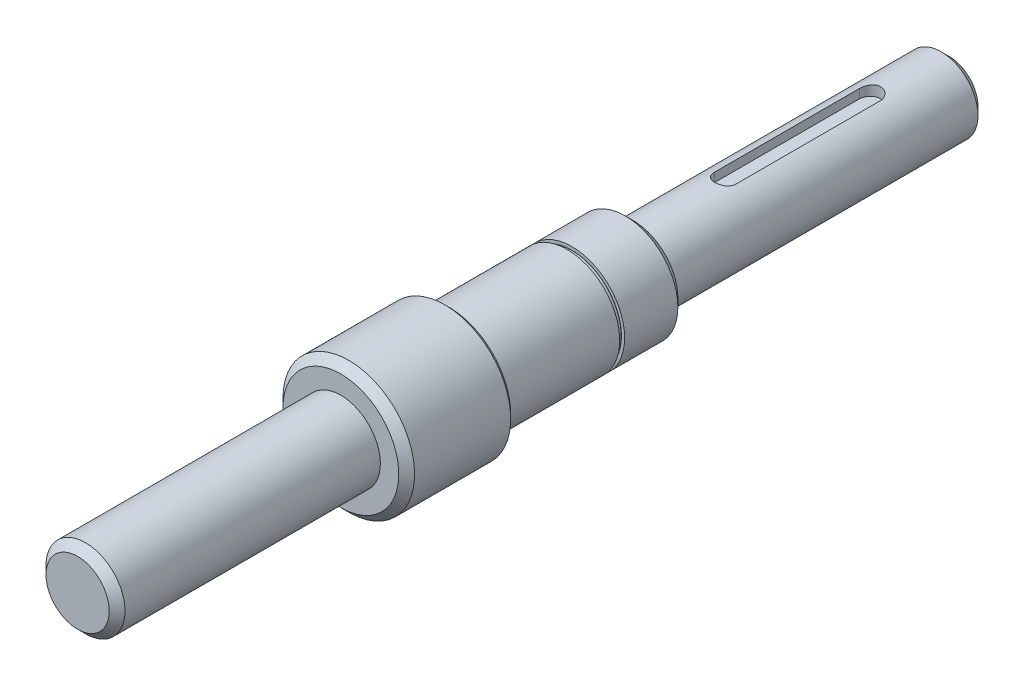
ISO-10303-21;
HEADER;
FILE_DESCRIPTION(('STEP AP214'),'2;1');
FILE_NAME('part.step','',(''),(''),'','','');
FILE_SCHEMA(('AUTOMOTIVE_DESIGN { 1 0 10303 214 1 1 1 1 }'));
ENDSEC;
DATA;
#1=APPLICATION_CONTEXT('core data for automotive mechanical design processes');
#2=APPLICATION_PROTOCOL_DEFINITION('international standard','automotive_design',2000,#1);
#3=PRODUCT_CONTEXT('',#1,'mechanical');
#4=PRODUCT('Part','Part','',(#3));
#5=PRODUCT_RELATED_PRODUCT_CATEGORY('part','',(#4));
#6=PRODUCT_DEFINITION_FORMATION('','',#4);
#7=PRODUCT_DEFINITION_CONTEXT('part definition',#1,'design');
#8=PRODUCT_DEFINITION('design','',#6,#7);
#9=PRODUCT_DEFINITION_SHAPE('','',#8);
#10=(LENGTH_UNIT() NAMED_UNIT(*) SI_UNIT(.MILLI.,.METRE.));
#11=(NAMED_UNIT(*) PLANE_ANGLE_UNIT() SI_UNIT($,.RADIAN.));
#12=(NAMED_UNIT(*) SI_UNIT($,.STERADIAN.) SOLID_ANGLE_UNIT());
#13=UNCERTAINTY_MEASURE_WITH_UNIT(LENGTH_MEASURE(1.E-05),#10,'distance_accuracy_value','');
#14=(GEOMETRIC_REPRESENTATION_CONTEXT(3) GLOBAL_UNCERTAINTY_ASSIGNED_CONTEXT((#13)) GLOBAL_UNIT_ASSIGNED_CONTEXT((#10,
#11,#12)) REPRESENTATION_CONTEXT('',''));
#15=CARTESIAN_POINT('',(0.,0.,0.));
#16=DIRECTION('',(0.,0.,1.));
#17=DIRECTION('',(1.,0.,0.));
#18=AXIS2_PLACEMENT_3D('',#15,#16,#17);
#19=CARTESIAN_POINT('',(0.,0.,0.));
#20=DIRECTION('',(0.,0.,1.));
#21=DIRECTION('',(1.,0.,0.));
#22=AXIS2_PLACEMENT_3D('',#19,#20,#21);
#23=CYLINDRICAL_SURFACE('',#22,20.);
#24=CARTESIAN_POINT('',(0.,0.,-185.925));
#25=DIRECTION('',(0.,0.,-1.));
#26=DIRECTION('',(-1.,0.,0.));
#27=AXIS2_PLACEMENT_3D('',#24,#25,#26);
#28=CIRCLE('',#27,20.);
#29=CARTESIAN_POINT('',(-20.,0.,-185.925));
#30=VERTEX_POINT('',#29);
#31=EDGE_CURVE('E124',#30,#30,#28,.T.);
#32=ORIENTED_EDGE('',*,*,#31,.F.);
#33=EDGE_LOOP('',(#32));
#34=FACE_BOUND('',#33,.T.);
#35=CARTESIAN_POINT('',(0.,0.,-141.));
#36=DIRECTION('',(0.,0.,-1.));
#37=DIRECTION('',(-1.,0.,0.));
#38=AXIS2_PLACEMENT_3D('',#35,#36,#37);
#39=CIRCLE('',#38,20.);
#40=CARTESIAN_POINT('',(-20.,0.,-141.));
#41=VERTEX_POINT('',#40);
#42=EDGE_CURVE('E111',#41,#41,#39,.T.);
#43=ORIENTED_EDGE('',*,*,#42,.T.);
#44=EDGE_LOOP('',(#43));
#45=FACE_BOUND('',#44,.T.);
#46=ADVANCED_FACE('F47',(#34,#45),#23,.T.);
#47=CARTESIAN_POINT('',(0.,0.,-185.925));
#48=DIRECTION('',(0.,0.,-1.));
#49=DIRECTION('',(-1.,0.,0.));
#50=AXIS2_PLACEMENT_3D('',#47,#48,#49);
#51=PLANE('',#50);
#52=CARTESIAN_POINT('',(0.,0.,-185.925));
#53=DIRECTION('',(0.,0.,-1.));
#54=DIRECTION('',(-1.,0.,0.));
#55=AXIS2_PLACEMENT_3D('',#52,#53,#54);
#56=CIRCLE('',#55,18.8);
#57=CARTESIAN_POINT('',(-18.8,0.,-185.925));
#58=VERTEX_POINT('',#57);
#59=EDGE_CURVE('E168',#58,#58,#56,.F.);
#60=ORIENTED_EDGE('',*,*,#59,.T.);
#61=EDGE_LOOP('',(#60));
#62=FACE_BOUND('',#61,.T.);
#63=ORIENTED_EDGE('',*,*,#31,.T.);
#64=EDGE_LOOP('',(#63));
#65=FACE_BOUND('',#64,.T.);
#66=ADVANCED_FACE('F235',(#62,#65),#51,.T.);
#67=CARTESIAN_POINT('',(0.,0.,-187.775));
#68=DIRECTION('',(0.,0.,-1.));
#69=DIRECTION('',(-1.,0.,0.));
#70=AXIS2_PLACEMENT_3D('',#67,#68,#69);
#71=PLANE('',#70);
#72=CARTESIAN_POINT('',(0.,0.,-187.775));
#73=DIRECTION('',(0.,0.,-1.));
#74=DIRECTION('',(-1.,0.,0.));
#75=AXIS2_PLACEMENT_3D('',#72,#73,#74);
#76=CIRCLE('',#75,18.8);
#77=CARTESIAN_POINT('',(-18.8,0.,-187.775));
#78=VERTEX_POINT('',#77);
#79=EDGE_CURVE('E169',#78,#78,#76,.T.);
#80=ORIENTED_EDGE('',*,*,#79,.T.);
#81=EDGE_LOOP('',(#80));
#82=FACE_BOUND('',#81,.T.);
#83=CARTESIAN_POINT('',(0.,0.,-187.775));
#84=DIRECTION('',(0.,0.,-1.));
#85=DIRECTION('',(-1.,0.,0.));
#86=AXIS2_PLACEMENT_3D('',#83,#84,#85);
#87=CIRCLE('',#86,20.);
#88=CARTESIAN_POINT('',(-20.,0.,-187.775));
#89=VERTEX_POINT('',#88);
#90=EDGE_CURVE('E121',#89,#89,#87,.T.);
#91=ORIENTED_EDGE('',*,*,#90,.F.);
#92=EDGE_LOOP('',(#91));
#93=FACE_BOUND('',#92,.T.);
#94=ADVANCED_FACE('F238',(#82,#93),#71,.F.);
#95=CARTESIAN_POINT('',(0.,0.,-185.925));
#96=DIRECTION('',(0.,0.,-1.));
#97=DIRECTION('',(-1.,0.,0.));
#98=AXIS2_PLACEMENT_3D('',#95,#96,#97);
#99=CYLINDRICAL_SURFACE('',#98,18.75);
#100=CARTESIAN_POINT('',(0.,0.,-185.975));
#101=DIRECTION('',(0.,0.,-1.));
#102=DIRECTION('',(-1.,0.,0.));
#103=AXIS2_PLACEMENT_3D('',#100,#101,#102);
#104=CIRCLE('',#103,18.75);
#105=CARTESIAN_POINT('',(-18.75,0.,-185.975));
#106=VERTEX_POINT('',#105);
#107=EDGE_CURVE('E164',#106,#106,#104,.T.);
#108=ORIENTED_EDGE('',*,*,#107,.T.);
#109=EDGE_LOOP('',(#108));
#110=FACE_BOUND('',#109,.T.);
#111=CARTESIAN_POINT('',(0.,0.,-187.725));
#112=DIRECTION('',(0.,0.,-1.));
#113=DIRECTION('',(-1.,0.,0.));
#114=AXIS2_PLACEMENT_3D('',#111,#112,#113);
#115=CIRCLE('',#114,18.75);
#116=CARTESIAN_POINT('',(-18.75,0.,-187.725));
#117=VERTEX_POINT('',#116);
#118=EDGE_CURVE('E158',#117,#117,#115,.F.);
#119=ORIENTED_EDGE('',*,*,#118,.T.);
#120=EDGE_LOOP('',(#119));
#121=FACE_BOUND('',#120,.T.);
#122=ADVANCED_FACE('F205',(#110,#121),#99,.T.);
#123=CARTESIAN_POINT('',(0.,0.,-301.));
#124=DIRECTION('',(0.,0.,-1.));
#125=DIRECTION('',(-1.,0.,0.));
#126=AXIS2_PLACEMENT_3D('',#123,#124,#125);
#127=CONICAL_SURFACE('',#126,5.09999999999999,1.02974425867665);
#128=CARTESIAN_POINT('',(0.,0.,-297.935610842959));
#129=VERTEX_POINT('',#128);
#130=VERTEX_LOOP('',#129);
#131=FACE_BOUND('',#130,.T.);
#132=CARTESIAN_POINT('',(0.,0.,-301.));
#133=DIRECTION('',(0.,0.,-1.));
#134=DIRECTION('',(-1.,0.,0.));
#135=AXIS2_PLACEMENT_3D('',#132,#133,#134);
#136=CIRCLE('',#135,5.09999999999999);
#137=CARTESIAN_POINT('',(-5.09999999999999,0.,-301.));
#138=VERTEX_POINT('',#137);
#139=EDGE_CURVE('E134',#138,#138,#136,.T.);
#140=ORIENTED_EDGE('',*,*,#139,.T.);
#141=EDGE_LOOP('',(#140));
#142=FACE_BOUND('',#141,.T.);
#143=ADVANCED_FACE('F387',(#131,#142),#127,.F.);
#144=CARTESIAN_POINT('',(0.,0.,-331.));
#145=DIRECTION('',(0.,0.,-1.));
#146=DIRECTION('',(-1.,0.,0.));
#147=AXIS2_PLACEMENT_3D('',#144,#145,#146);
#148=CYLINDRICAL_SURFACE('',#147,5.09999999999999);
#149=ORIENTED_EDGE('',*,*,#139,.F.);
#150=EDGE_LOOP('',(#149));
#151=FACE_BOUND('',#150,.T.);
#152=CARTESIAN_POINT('',(0.,0.,-331.));
#153=DIRECTION('',(0.,0.,-1.));
#154=DIRECTION('',(-1.,0.,0.));
#155=AXIS2_PLACEMENT_3D('',#152,#153,#154);
#156=CIRCLE('',#155,5.1);
#157=CARTESIAN_POINT('',(-5.1,0.,-331.));
#158=VERTEX_POINT('',#157);
#159=EDGE_CURVE('E127',#158,#158,#156,.T.);
#160=ORIENTED_EDGE('',*,*,#159,.T.);
#161=EDGE_LOOP('',(#160));
#162=FACE_BOUND('',#161,.T.);
#163=ADVANCED_FACE('F386',(#151,#162),#148,.F.);
#164=CARTESIAN_POINT('',(0.,14.,-331.));
#165=DIRECTION('',(0.,0.,1.));
#166=DIRECTION('',(1.,0.,0.));
#167=AXIS2_PLACEMENT_3D('',#164,#165,#166);
#168=PLANE('',#167);
#169=ORIENTED_EDGE('',*,*,#159,.F.);
#170=EDGE_LOOP('',(#169));
#171=FACE_BOUND('',#170,.T.);
#172=CARTESIAN_POINT('',(0.,0.,-331.));
#173=DIRECTION('',(0.,0.,1.));
#174=DIRECTION('',(1.,0.,0.));
#175=AXIS2_PLACEMENT_3D('',#172,#173,#174);
#176=CIRCLE('',#175,11.0000000000001);
#177=CARTESIAN_POINT('',(11.0000000000001,0.,-331.));
#178=VERTEX_POINT('',#177);
#179=EDGE_CURVE('E160',#178,#178,#176,.F.);
#180=ORIENTED_EDGE('',*,*,#179,.T.);
#181=EDGE_LOOP('',(#180));
#182=FACE_BOUND('',#181,.T.);
#183=ADVANCED_FACE('F266',(#171,#182),#168,.F.);
#184=CARTESIAN_POINT('',(0.,0.,-328.));
#185=DIRECTION('',(0.,0.,1.));
#186=DIRECTION('',(1.,0.,0.));
#187=AXIS2_PLACEMENT_3D('',#184,#185,#186);
#188=CONICAL_SURFACE('',#187,14.,0.785398163397451);
#189=ORIENTED_EDGE('',*,*,#179,.F.);
#190=EDGE_LOOP('',(#189));
#191=FACE_BOUND('',#190,.T.);
#192=CARTESIAN_POINT('',(0.,0.,-328.));
#193=DIRECTION('',(0.,0.,1.));
#194=DIRECTION('',(1.,0.,0.));
#195=AXIS2_PLACEMENT_3D('',#192,#193,#194);
#196=CIRCLE('',#195,14.);
#197=CARTESIAN_POINT('',(14.,0.,-328.));
#198=VERTEX_POINT('',#197);
#199=EDGE_CURVE('E152',#198,#198,#196,.T.);
#200=ORIENTED_EDGE('',*,*,#199,.F.);
#201=EDGE_LOOP('',(#200));
#202=FACE_BOUND('',#201,.T.);
#203=ADVANCED_FACE('F257',(#191,#202),#188,.T.);
#204=CARTESIAN_POINT('',(0.,0.,0.));
#205=DIRECTION('',(0.,0.,1.));
#206=DIRECTION('',(1.,0.,0.));
#207=AXIS2_PLACEMENT_3D('',#204,#205,#206);
#208=CYLINDRICAL_SURFACE('',#207,14.);
#209=DIRECTION('',(0.,0.,1.));
#210=VECTOR('',#209,1.);
#211=CARTESIAN_POINT('',(-4.00000000000005,13.4164078649987,0.));
#212=LINE('',#211,#210);
#213=CARTESIAN_POINT('',(-4.00000000000001,13.4164078649987,-246.));
#214=VERTEX_POINT('',#213);
#215=CARTESIAN_POINT('',(-4.,13.4164078649987,-301.));
#216=VERTEX_POINT('',#215);
#217=EDGE_CURVE('E182',#214,#216,#212,.F.);
#218=ORIENTED_EDGE('',*,*,#217,.T.);
#219=CARTESIAN_POINT('',(-4.,13.4164078649987,-301.));
#220=CARTESIAN_POINT('',(-4.00001343424813,13.4163934343768,-301.110036938265));
#221=CARTESIAN_POINT('',(-3.99545969266926,13.417761265702,-301.220065459872));
#222=CARTESIAN_POINT('',(-3.97732232121695,13.4231542734801,-301.439287989373));
#223=CARTESIAN_POINT('',(-3.96374056379899,13.4271788988993,-301.548482165565));
#224=CARTESIAN_POINT('',(-3.92769415038321,13.4377658850065,-301.765008682583));
#225=CARTESIAN_POINT('',(-3.90525054417986,13.4443222312206,-301.872344810754));
#226=CARTESIAN_POINT('',(-3.85169716989989,13.4597622573638,-302.084633002554));
#227=CARTESIAN_POINT('',(-3.82058720849962,13.4686459892105,-302.189585012944));
#228=CARTESIAN_POINT('',(-3.71462722105447,13.4984072106126,-302.499717642999));
#229=CARTESIAN_POINT('',(-3.6271037719038,13.5224082651875,-302.700432400308));
#230=CARTESIAN_POINT('',(-3.42099335445292,13.5760110031023,-303.084316862067));
#231=CARTESIAN_POINT('',(-3.30239378136284,13.6056149576787,-303.267479405898));
#232=CARTESIAN_POINT('',(-3.03385514387189,13.6680345915526,-303.616369404888));
#233=CARTESIAN_POINT('',(-2.88318637668458,13.7009134336833,-303.78152502006));
#234=CARTESIAN_POINT('',(-2.55635049218509,13.7656378360174,-304.08460135598));
#235=CARTESIAN_POINT('',(-2.38017915468808,13.7974832241344,-304.222517560181));
#236=CARTESIAN_POINT('',(-2.00328797864422,13.8572672913436,-304.46965938831));
#237=CARTESIAN_POINT('',(-1.80217262010784,13.885122326296,-304.57830390558));
#238=CARTESIAN_POINT('',(-1.38360719231062,13.9330517158678,-304.760007003573));
#239=CARTESIAN_POINT('',(-1.1661610438381,13.9531279309862,-304.833074094601));
#240=CARTESIAN_POINT('',(-0.727119470413165,13.9827902284191,-304.939668316764));
#241=CARTESIAN_POINT('',(-0.505780313916704,13.9926363331616,-304.974177311461));
#242=CARTESIAN_POINT('',(-0.0602449633135534,14.0016419286283,-305.005773527505));
#243=CARTESIAN_POINT('',(0.163950738694262,14.0008032358133,-305.002867109631));
#244=CARTESIAN_POINT('',(0.601961495843499,13.9887201082301,-304.960387183875));
#245=CARTESIAN_POINT('',(0.815889248066107,13.9777773149303,-304.921876540054));
#246=CARTESIAN_POINT('',(1.23410663687488,13.9470775079522,-304.811008876966));
#247=CARTESIAN_POINT('',(1.43839578630405,13.9273200492871,-304.738650148951));
#248=CARTESIAN_POINT('',(1.8341490169319,13.8807804985664,-304.561381109693));
#249=CARTESIAN_POINT('',(2.02544821255194,13.8539238723959,-304.456123112832));
#250=CARTESIAN_POINT('',(2.38801825135017,13.7960546774321,-304.216306263055));
#251=CARTESIAN_POINT('',(2.55928501856377,13.7650412656095,-304.081741463019));
#252=CARTESIAN_POINT('',(2.88324485398745,13.7009177251593,-303.781613203087));
#253=CARTESIAN_POINT('',(3.03507809124178,13.6677722027509,-303.615129667492));
#254=CARTESIAN_POINT('',(3.30897556854654,13.6040627781022,-303.258573557128));
#255=CARTESIAN_POINT('',(3.43103136574908,13.573499609643,-303.068494315225));
#256=CARTESIAN_POINT('',(3.58945338157004,13.5321405016799,-302.768841328102));
#257=CARTESIAN_POINT('',(3.63832313759783,13.5190503394637,-302.666010156567));
#258=CARTESIAN_POINT('',(3.72718558970198,13.4948216745023,-302.456373741282));
#259=CARTESIAN_POINT('',(3.76718189032699,13.4836823796704,-302.349570131867));
#260=CARTESIAN_POINT('',(3.83791732102716,13.463719461374,-302.132861334789));
#261=CARTESIAN_POINT('',(3.86866612224973,13.4548934199316,-302.022959519801));
#262=CARTESIAN_POINT('',(3.92067829243348,13.4398293634308,-301.800804060039));
#263=CARTESIAN_POINT('',(3.9419460559715,13.4335901494402,-301.688551530165));
#264=CARTESIAN_POINT('',(3.97223001063663,13.4246640965205,-301.480267797862));
#265=CARTESIAN_POINT('',(3.98264484818433,13.4215735027143,-301.384454640876));
#266=CARTESIAN_POINT('',(3.99652828145244,13.4174428037393,-301.192430219405));
#267=CARTESIAN_POINT('',(4.00000747148811,13.4163995712304,-301.096219787408));
#268=CARTESIAN_POINT('',(4.,13.4164078649987,-301.));
#269=B_SPLINE_CURVE_WITH_KNOTS('',3,(#219,#220,#221,#222,#223,#224,#225,#226,#227,#228,#229,
#230,#231,#232,#233,#234,#235,#236,#237,#238,#239,#240,#241,#242,#243,#244,#245,#246,#247,#248,
#249,#250,#251,#252,#253,#254,#255,#256,#257,#258,#259,#260,#261,#262,#263,#264,#265,#266,#267,
#268),.UNSPECIFIED.,.F.,.F.,(4,2,2,2,2,2,2,2,2,2,2,2,2,2,2,2,2,2,2,2,2,2,2,2,4),(0.,
0.32999374304361,0.659919065086379,0.98906537585001,1.31821902959231,1.97575167696559,
2.6335514401874,3.30832474645295,3.98320984263715,4.67064278038706,5.35791119973412,
6.02724874934375,6.69647251025091,7.34634193868017,7.99624417788576,8.65326120487291,
9.31041168231768,9.99056134493204,10.6709036279931,11.0143588121195,11.357674222404,
11.700629330619,12.0434253092463,12.3324405185762,12.6210139131113),.UNSPECIFIED.);
#270=CARTESIAN_POINT('',(4.,13.4164078649987,-301.));
#271=VERTEX_POINT('',#270);
#272=EDGE_CURVE('E203',#216,#271,#269,.T.);
#273=ORIENTED_EDGE('',*,*,#272,.T.);
#274=DIRECTION('',(0.,0.,1.));
#275=VECTOR('',#274,1.);
#276=CARTESIAN_POINT('',(3.99999999999997,13.4164078649987,0.));
#277=LINE('',#276,#275);
#278=CARTESIAN_POINT('',(3.99999999999997,13.4164078649987,-246.));
#279=VERTEX_POINT('',#278);
#280=EDGE_CURVE('E94',#271,#279,#277,.T.);
#281=ORIENTED_EDGE('',*,*,#280,.T.);
#282=CARTESIAN_POINT('',(3.99999999999999,13.4164078649987,-246.));
#283=CARTESIAN_POINT('',(4.00001343424813,13.4163934343768,-245.889963061735));
#284=CARTESIAN_POINT('',(3.99545969266926,13.417761265702,-245.779934540128));
#285=CARTESIAN_POINT('',(3.97732232121694,13.4231542734801,-245.560712010627));
#286=CARTESIAN_POINT('',(3.96374056379898,13.4271788988993,-245.451517834435));
#287=CARTESIAN_POINT('',(3.9276941503832,13.4377658850065,-245.234991317418));
#288=CARTESIAN_POINT('',(3.90525054417985,13.4443222312206,-245.127655189246));
#289=CARTESIAN_POINT('',(3.85169716989988,13.4597622573638,-244.915366997446));
#290=CARTESIAN_POINT('',(3.82058720849961,13.4686459892105,-244.810414987056));
#291=CARTESIAN_POINT('',(3.71462722105447,13.4984072106126,-244.500282357001));
#292=CARTESIAN_POINT('',(3.62710377190382,13.5224082651875,-244.299567599693));
#293=CARTESIAN_POINT('',(3.42099335445293,13.5760110031023,-243.915683137933));
#294=CARTESIAN_POINT('',(3.30239378136283,13.6056149576788,-243.732520594102));
#295=CARTESIAN_POINT('',(3.03385514387187,13.6680345915527,-243.383630595112));
#296=CARTESIAN_POINT('',(2.88318637668458,13.7009134336833,-243.21847497994));
#297=CARTESIAN_POINT('',(2.55635049218508,13.7656378360174,-242.91539864402));
#298=CARTESIAN_POINT('',(2.38017915468807,13.7974832241344,-242.777482439819));
#299=CARTESIAN_POINT('',(2.00328797864421,13.8572672913436,-242.53034061169));
#300=CARTESIAN_POINT('',(1.80217262010786,13.885122326296,-242.42169609442));
#301=CARTESIAN_POINT('',(1.38360719231065,13.9330517158678,-242.239992996427));
#302=CARTESIAN_POINT('',(1.16616104383813,13.9531279309862,-242.166925905399));
#303=CARTESIAN_POINT('',(0.727119470413182,13.9827902284191,-242.060331683236));
#304=CARTESIAN_POINT('',(0.505780313916717,13.9926363331616,-242.025822688539));
#305=CARTESIAN_POINT('',(0.0602449633135534,14.0016419286283,-241.994226472495));
#306=CARTESIAN_POINT('',(-0.163950738694273,14.0008032358133,-241.997132890369));
#307=CARTESIAN_POINT('',(-0.601961495843524,13.9887201082301,-242.039612816125));
#308=CARTESIAN_POINT('',(-0.815889248066136,13.9777773149303,-242.078123459946));
#309=CARTESIAN_POINT('',(-1.2341066368749,13.9470775079522,-242.188991123034));
#310=CARTESIAN_POINT('',(-1.43839578630406,13.9273200492871,-242.261349851049));
#311=CARTESIAN_POINT('',(-1.8341490169319,13.8807804985664,-242.438618890307));
#312=CARTESIAN_POINT('',(-2.02544821255194,13.8539238723959,-242.543876887169));
#313=CARTESIAN_POINT('',(-2.38801825135016,13.7960546774321,-242.783693736945));
#314=CARTESIAN_POINT('',(-2.55928501856377,13.7650412656095,-242.918258536981));
#315=CARTESIAN_POINT('',(-2.88324485398744,13.7009177251593,-243.218386796913));
#316=CARTESIAN_POINT('',(-3.03507809124177,13.6677722027509,-243.384870332508));
#317=CARTESIAN_POINT('',(-3.30897556854653,13.6040627781022,-243.741426442872));
#318=CARTESIAN_POINT('',(-3.43103136574906,13.573499609643,-243.931505684775));
#319=CARTESIAN_POINT('',(-3.58945338157004,13.5321405016799,-244.231158671898));
#320=CARTESIAN_POINT('',(-3.63832313759783,13.5190503394637,-244.333989843433));
#321=CARTESIAN_POINT('',(-3.72718558970199,13.4948216745023,-244.543626258718));
#322=CARTESIAN_POINT('',(-3.767181890327,13.4836823796704,-244.650429868133));
#323=CARTESIAN_POINT('',(-3.83791732102718,13.463719461374,-244.867138665211));
#324=CARTESIAN_POINT('',(-3.86866612224974,13.4548934199316,-244.977040480199));
#325=CARTESIAN_POINT('',(-3.92067829243349,13.4398293634308,-245.199195939961));
#326=CARTESIAN_POINT('',(-3.94194605597151,13.4335901494402,-245.311448469835));
#327=CARTESIAN_POINT('',(-3.97223001063664,13.4246640965205,-245.519732202138));
#328=CARTESIAN_POINT('',(-3.98264484818435,13.4215735027143,-245.615545359124));
#329=CARTESIAN_POINT('',(-3.99652828145244,13.4174428037393,-245.807569780596));
#330=CARTESIAN_POINT('',(-4.00000747148811,13.4163995712304,-245.903780212592));
#331=CARTESIAN_POINT('',(-4.00000000000001,13.4164078649987,-246.));
#332=B_SPLINE_CURVE_WITH_KNOTS('',3,(#282,#283,#284,#285,#286,#287,#288,#289,#290,#291,#292,
#293,#294,#295,#296,#297,#298,#299,#300,#301,#302,#303,#304,#305,#306,#307,#308,#309,#310,#311,
#312,#313,#314,#315,#316,#317,#318,#319,#320,#321,#322,#323,#324,#325,#326,#327,#328,#329,#330,
#331),.UNSPECIFIED.,.F.,.F.,(4,2,2,2,2,2,2,2,2,2,2,2,2,2,2,2,2,2,2,2,2,2,2,2,4),(0.,
0.329993743043637,0.65991906508638,0.989065375850039,1.31821902959231,1.97575167696556,
2.63355144018741,3.30832474645297,3.98320984263714,4.67064278038705,5.35791119973408,
6.02724874934374,6.69647251025093,7.3463419386802,7.99624417788576,8.65326120487288,
9.31041168231765,9.99056134493198,10.6709036279931,11.0143588121194,11.357674222404,
11.700629330619,12.0434253092463,12.3324405185763,12.6210139131113),.UNSPECIFIED.);
#333=EDGE_CURVE('E171',#279,#214,#332,.T.);
#334=ORIENTED_EDGE('',*,*,#333,.T.);
#335=EDGE_LOOP('',(#218,#273,#281,#334));
#336=FACE_BOUND('',#335,.T.);
#337=ORIENTED_EDGE('',*,*,#199,.T.);
#338=EDGE_LOOP('',(#337));
#339=FACE_BOUND('',#338,.T.);
#340=CARTESIAN_POINT('',(0.,0.,-211.));
#341=DIRECTION('',(0.,0.,1.));
#342=DIRECTION('',(1.,0.,0.));
#343=AXIS2_PLACEMENT_3D('',#340,#341,#342);
#344=CIRCLE('',#343,14.);
#345=CARTESIAN_POINT('',(14.,0.,-211.));
#346=VERTEX_POINT('',#345);
#347=EDGE_CURVE('E137',#346,#346,#344,.T.);
#348=ORIENTED_EDGE('',*,*,#347,.F.);
#349=EDGE_LOOP('',(#348));
#350=FACE_BOUND('',#349,.T.);
#351=ADVANCED_FACE('F185',(#336,#339,#350),#208,.T.);
#352=CARTESIAN_POINT('',(0.,20.,-211.));
#353=DIRECTION('',(0.,0.,1.));
#354=DIRECTION('',(1.,0.,0.));
#355=AXIS2_PLACEMENT_3D('',#352,#353,#354);
#356=PLANE('',#355);
#357=CARTESIAN_POINT('',(0.,0.,-211.));
#358=DIRECTION('',(0.,0.,1.));
#359=DIRECTION('',(1.,0.,0.));
#360=AXIS2_PLACEMENT_3D('',#357,#358,#359);
#361=CIRCLE('',#360,17.0000000000001);
#362=CARTESIAN_POINT('',(17.0000000000001,0.,-211.));
#363=VERTEX_POINT('',#362);
#364=EDGE_CURVE('E11',#363,#363,#361,.F.);
#365=ORIENTED_EDGE('',*,*,#364,.T.);
#366=EDGE_LOOP('',(#365));
#367=FACE_BOUND('',#366,.T.);
#368=ORIENTED_EDGE('',*,*,#347,.T.);
#369=EDGE_LOOP('',(#368));
#370=FACE_BOUND('',#369,.T.);
#371=ADVANCED_FACE('F248',(#367,#370),#356,.F.);
#372=CARTESIAN_POINT('',(0.,0.,-208.));
#373=DIRECTION('',(0.,0.,1.));
#374=DIRECTION('',(1.,0.,0.));
#375=AXIS2_PLACEMENT_3D('',#372,#373,#374);
#376=CIRCLE('',#375,20.);
#377=CARTESIAN_POINT('',(20.,0.,-208.));
#378=VERTEX_POINT('',#377);
#379=EDGE_CURVE('E59',#378,#378,#376,.T.);
#380=ORIENTED_EDGE('',*,*,#379,.T.);
#381=EDGE_LOOP('',(#380));
#382=FACE_BOUND('',#381,.T.);
#383=ORIENTED_EDGE('',*,*,#90,.T.);
#384=EDGE_LOOP('',(#383));
#385=FACE_BOUND('',#384,.T.);
#386=ADVANCED_FACE('F216',(#382,#385),#23,.T.);
#387=CARTESIAN_POINT('',(0.,0.,-185.975));
#388=DIRECTION('',(0.,0.,-1.));
#389=DIRECTION('',(-1.,0.,0.));
#390=AXIS2_PLACEMENT_3D('',#387,#388,#389);
#391=TOROIDAL_SURFACE('',#390,18.8,0.05);
#392=ORIENTED_EDGE('',*,*,#59,.F.);
#393=EDGE_LOOP('',(#392));
#394=FACE_BOUND('',#393,.T.);
#395=ORIENTED_EDGE('',*,*,#107,.F.);
#396=EDGE_LOOP('',(#395));
#397=FACE_BOUND('',#396,.T.);
#398=ADVANCED_FACE('F242',(#394,#397),#391,.F.);
#399=CARTESIAN_POINT('',(0.,0.,-187.725));
#400=DIRECTION('',(0.,0.,-1.));
#401=DIRECTION('',(-1.,0.,0.));
#402=AXIS2_PLACEMENT_3D('',#399,#400,#401);
#403=TOROIDAL_SURFACE('',#402,18.8,0.05);
#404=ORIENTED_EDGE('',*,*,#118,.F.);
#405=EDGE_LOOP('',(#404));
#406=FACE_BOUND('',#405,.T.);
#407=ORIENTED_EDGE('',*,*,#79,.F.);
#408=EDGE_LOOP('',(#407));
#409=FACE_BOUND('',#408,.T.);
#410=ADVANCED_FACE('F201',(#406,#409),#403,.F.);
#411=CARTESIAN_POINT('',(0.,25.,-301.));
#412=DIRECTION('',(0.,-1.,0.));
#413=DIRECTION('',(0.,0.,-1.));
#414=AXIS2_PLACEMENT_3D('',#411,#412,#413);
#415=CYLINDRICAL_SURFACE('',#414,4.);
#416=DIRECTION('',(0.,-1.,0.));
#417=VECTOR('',#416,1.);
#418=CARTESIAN_POINT('',(-4.,25.,-301.));
#419=LINE('',#418,#417);
#420=CARTESIAN_POINT('',(-4.,10.,-301.));
#421=VERTEX_POINT('',#420);
#422=EDGE_CURVE('E115',#216,#421,#419,.T.);
#423=ORIENTED_EDGE('',*,*,#422,.T.);
#424=CARTESIAN_POINT('',(0.,10.,-301.));
#425=DIRECTION('',(0.,-1.,0.));
#426=DIRECTION('',(0.,0.,-1.));
#427=AXIS2_PLACEMENT_3D('',#424,#425,#426);
#428=CIRCLE('',#427,4.);
#429=CARTESIAN_POINT('',(4.,10.,-301.));
#430=VERTEX_POINT('',#429);
#431=EDGE_CURVE('E104',#421,#430,#428,.T.);
#432=ORIENTED_EDGE('',*,*,#431,.T.);
#433=DIRECTION('',(0.,-1.,0.));
#434=VECTOR('',#433,1.);
#435=CARTESIAN_POINT('',(4.,25.,-301.));
#436=LINE('',#435,#434);
#437=EDGE_CURVE('E86',#271,#430,#436,.T.);
#438=ORIENTED_EDGE('',*,*,#437,.F.);
#439=ORIENTED_EDGE('',*,*,#272,.F.);
#440=EDGE_LOOP('',(#423,#432,#438,#439));
#441=FACE_BOUND('',#440,.T.);
#442=ADVANCED_FACE('F109',(#441),#415,.F.);
#443=CARTESIAN_POINT('',(-4.,25.,-301.));
#444=DIRECTION('',(-1.,0.,0.));
#445=DIRECTION('',(0.,0.,1.));
#446=AXIS2_PLACEMENT_3D('',#443,#444,#445);
#447=PLANE('',#446);
#448=DIRECTION('',(0.,-1.,0.));
#449=VECTOR('',#448,1.);
#450=CARTESIAN_POINT('',(-4.00000000000001,25.,-246.));
#451=LINE('',#450,#449);
#452=CARTESIAN_POINT('',(-4.00000000000001,10.,-246.));
#453=VERTEX_POINT('',#452);
#454=EDGE_CURVE('E125',#214,#453,#451,.T.);
#455=ORIENTED_EDGE('',*,*,#454,.T.);
#456=DIRECTION('',(0.,0.,-1.));
#457=VECTOR('',#456,1.);
#458=CARTESIAN_POINT('',(-4.,10.,-301.));
#459=LINE('',#458,#457);
#460=EDGE_CURVE('E96',#453,#421,#459,.T.);
#461=ORIENTED_EDGE('',*,*,#460,.T.);
#462=ORIENTED_EDGE('',*,*,#422,.F.);
#463=ORIENTED_EDGE('',*,*,#217,.F.);
#464=EDGE_LOOP('',(#455,#461,#462,#463));
#465=FACE_BOUND('',#464,.T.);
#466=ADVANCED_FACE('F193',(#465),#447,.F.);
#467=CARTESIAN_POINT('',(0.,25.,-246.));
#468=DIRECTION('',(0.,-1.,0.));
#469=DIRECTION('',(0.,0.,-1.));
#470=AXIS2_PLACEMENT_3D('',#467,#468,#469);
#471=CYLINDRICAL_SURFACE('',#470,4.);
#472=DIRECTION('',(0.,-1.,0.));
#473=VECTOR('',#472,1.);
#474=CARTESIAN_POINT('',(4.,25.,-246.));
#475=LINE('',#474,#473);
#476=CARTESIAN_POINT('',(4.,10.,-246.));
#477=VERTEX_POINT('',#476);
#478=EDGE_CURVE('E63',#279,#477,#475,.T.);
#479=ORIENTED_EDGE('',*,*,#478,.T.);
#480=CARTESIAN_POINT('',(0.,10.,-246.));
#481=DIRECTION('',(0.,-1.,0.));
#482=DIRECTION('',(0.,0.,-1.));
#483=AXIS2_PLACEMENT_3D('',#480,#481,#482);
#484=CIRCLE('',#483,4.);
#485=EDGE_CURVE('E106',#477,#453,#484,.T.);
#486=ORIENTED_EDGE('',*,*,#485,.T.);
#487=ORIENTED_EDGE('',*,*,#454,.F.);
#488=ORIENTED_EDGE('',*,*,#333,.F.);
#489=EDGE_LOOP('',(#479,#486,#487,#488));
#490=FACE_BOUND('',#489,.T.);
#491=ADVANCED_FACE('F186',(#490),#471,.F.);
#492=CARTESIAN_POINT('',(4.,25.,-301.));
#493=DIRECTION('',(1.,0.,0.));
#494=DIRECTION('',(0.,0.,-1.));
#495=AXIS2_PLACEMENT_3D('',#492,#493,#494);
#496=PLANE('',#495);
#497=ORIENTED_EDGE('',*,*,#437,.T.);
#498=DIRECTION('',(0.,0.,1.));
#499=VECTOR('',#498,1.);
#500=CARTESIAN_POINT('',(4.,10.,-301.));
#501=LINE('',#500,#499);
#502=EDGE_CURVE('E95',#430,#477,#501,.T.);
#503=ORIENTED_EDGE('',*,*,#502,.T.);
#504=ORIENTED_EDGE('',*,*,#478,.F.);
#505=ORIENTED_EDGE('',*,*,#280,.F.);
#506=EDGE_LOOP('',(#497,#503,#504,#505));
#507=FACE_BOUND('',#506,.T.);
#508=ADVANCED_FACE('F93',(#507),#496,.F.);
#509=CARTESIAN_POINT('',(0.,10.,-301.));
#510=DIRECTION('',(0.,-1.,0.));
#511=DIRECTION('',(0.,0.,-1.));
#512=AXIS2_PLACEMENT_3D('',#509,#510,#511);
#513=PLANE('',#512);
#514=ORIENTED_EDGE('',*,*,#431,.F.);
#515=ORIENTED_EDGE('',*,*,#460,.F.);
#516=ORIENTED_EDGE('',*,*,#485,.F.);
#517=ORIENTED_EDGE('',*,*,#502,.F.);
#518=EDGE_LOOP('',(#514,#515,#516,#517));
#519=FACE_BOUND('',#518,.T.);
#520=ADVANCED_FACE('F101',(#519),#513,.F.);
#521=CARTESIAN_POINT('',(0.,0.,-141.));
#522=DIRECTION('',(0.,0.,-1.));
#523=DIRECTION('',(-1.,0.,0.));
#524=AXIS2_PLACEMENT_3D('',#521,#522,#523);
#525=PLANE('',#524);
#526=CARTESIAN_POINT('',(0.,0.,-141.));
#527=DIRECTION('',(0.,0.,-1.));
#528=DIRECTION('',(-1.,0.,0.));
#529=AXIS2_PLACEMENT_3D('',#526,#527,#528);
#530=CIRCLE('',#529,23.5);
#531=CARTESIAN_POINT('',(-23.5,0.,-141.));
#532=VERTEX_POINT('',#531);
#533=EDGE_CURVE('E208',#532,#532,#530,.T.);
#534=ORIENTED_EDGE('',*,*,#533,.T.);
#535=EDGE_LOOP('',(#534));
#536=FACE_BOUND('',#535,.T.);
#537=ORIENTED_EDGE('',*,*,#42,.F.);
#538=EDGE_LOOP('',(#537));
#539=FACE_BOUND('',#538,.T.);
#540=ADVANCED_FACE('F292',(#536,#539),#525,.T.);
#541=CARTESIAN_POINT('',(0.,0.,0.));
#542=DIRECTION('',(0.,0.,-1.));
#543=DIRECTION('',(-1.,0.,0.));
#544=AXIS2_PLACEMENT_3D('',#541,#542,#543);
#545=PLANE('',#544);
#546=CARTESIAN_POINT('',(0.,0.,0.));
#547=DIRECTION('',(0.,0.,-1.));
#548=DIRECTION('',(-1.,0.,0.));
#549=AXIS2_PLACEMENT_3D('',#546,#547,#548);
#550=CIRCLE('',#549,12.);
#551=CARTESIAN_POINT('',(-12.,0.,0.));
#552=VERTEX_POINT('',#551);
#553=EDGE_CURVE('E146',#552,#552,#550,.F.);
#554=ORIENTED_EDGE('',*,*,#553,.T.);
#555=EDGE_LOOP('',(#554));
#556=FACE_BOUND('',#555,.T.);
#557=ADVANCED_FACE('F323',(#556),#545,.F.);
#558=CARTESIAN_POINT('',(0.,0.,0.));
#559=DIRECTION('',(0.,0.,-1.));
#560=DIRECTION('',(-1.,0.,0.));
#561=AXIS2_PLACEMENT_3D('',#558,#559,#560);
#562=CONICAL_SURFACE('',#561,12.,0.785398163397449);
#563=CARTESIAN_POINT('',(0.,0.,-3.00000000000001));
#564=DIRECTION('',(0.,0.,-1.));
#565=DIRECTION('',(-1.,0.,0.));
#566=AXIS2_PLACEMENT_3D('',#563,#564,#565);
#567=CIRCLE('',#566,15.);
#568=CARTESIAN_POINT('',(-15.,0.,-3.00000000000001));
#569=VERTEX_POINT('',#568);
#570=EDGE_CURVE('E153',#569,#569,#567,.T.);
#571=ORIENTED_EDGE('',*,*,#570,.F.);
#572=EDGE_LOOP('',(#571));
#573=FACE_BOUND('',#572,.T.);
#574=ORIENTED_EDGE('',*,*,#553,.F.);
#575=EDGE_LOOP('',(#574));
#576=FACE_BOUND('',#575,.T.);
#577=ADVANCED_FACE('F340',(#573,#576),#562,.T.);
#578=CARTESIAN_POINT('',(0.,0.,0.));
#579=DIRECTION('',(0.,0.,1.));
#580=DIRECTION('',(1.,0.,0.));
#581=AXIS2_PLACEMENT_3D('',#578,#579,#580);
#582=CYLINDRICAL_SURFACE('',#581,15.);
#583=ORIENTED_EDGE('',*,*,#570,.T.);
#584=EDGE_LOOP('',(#583));
#585=FACE_BOUND('',#584,.T.);
#586=CARTESIAN_POINT('',(0.,0.,-100.));
#587=DIRECTION('',(0.,0.,1.));
#588=DIRECTION('',(1.,0.,0.));
#589=AXIS2_PLACEMENT_3D('',#586,#587,#588);
#590=CIRCLE('',#589,15.);
#591=CARTESIAN_POINT('',(15.,0.,-100.));
#592=VERTEX_POINT('',#591);
#593=EDGE_CURVE('E136',#592,#592,#590,.T.);
#594=ORIENTED_EDGE('',*,*,#593,.T.);
#595=EDGE_LOOP('',(#594));
#596=FACE_BOUND('',#595,.T.);
#597=ADVANCED_FACE('F348',(#585,#596),#582,.T.);
#598=CARTESIAN_POINT('',(0.,15.,-100.));
#599=DIRECTION('',(0.,0.,-1.));
#600=DIRECTION('',(-1.,0.,0.));
#601=AXIS2_PLACEMENT_3D('',#598,#599,#600);
#602=PLANE('',#601);
#603=CARTESIAN_POINT('',(0.,0.,-100.));
#604=DIRECTION('',(0.,0.,-1.));
#605=DIRECTION('',(-1.,0.,0.));
#606=AXIS2_PLACEMENT_3D('',#603,#604,#605);
#607=CIRCLE('',#606,22.);
#608=CARTESIAN_POINT('',(-22.,0.,-100.));
#609=VERTEX_POINT('',#608);
#610=EDGE_CURVE('E145',#609,#609,#607,.F.);
#611=ORIENTED_EDGE('',*,*,#610,.T.);
#612=EDGE_LOOP('',(#611));
#613=FACE_BOUND('',#612,.T.);
#614=ORIENTED_EDGE('',*,*,#593,.F.);
#615=EDGE_LOOP('',(#614));
#616=FACE_BOUND('',#615,.T.);
#617=ADVANCED_FACE('F356',(#613,#616),#602,.F.);
#618=CARTESIAN_POINT('',(0.,0.,-100.));
#619=DIRECTION('',(0.,0.,-1.));
#620=DIRECTION('',(-1.,0.,0.));
#621=AXIS2_PLACEMENT_3D('',#618,#619,#620);
#622=CONICAL_SURFACE('',#621,22.,0.785398163397443);
#623=CARTESIAN_POINT('',(0.,0.,-103.));
#624=DIRECTION('',(0.,0.,-1.));
#625=DIRECTION('',(-1.,0.,0.));
#626=AXIS2_PLACEMENT_3D('',#623,#624,#625);
#627=CIRCLE('',#626,25.);
#628=CARTESIAN_POINT('',(-25.,0.,-103.));
#629=VERTEX_POINT('',#628);
#630=EDGE_CURVE('E142',#629,#629,#627,.T.);
#631=ORIENTED_EDGE('',*,*,#630,.F.);
#632=EDGE_LOOP('',(#631));
#633=FACE_BOUND('',#632,.T.);
#634=ORIENTED_EDGE('',*,*,#610,.F.);
#635=EDGE_LOOP('',(#634));
#636=FACE_BOUND('',#635,.T.);
#637=ADVANCED_FACE('F304',(#633,#636),#622,.T.);
#638=CARTESIAN_POINT('',(0.,0.,0.));
#639=DIRECTION('',(0.,0.,1.));
#640=DIRECTION('',(1.,0.,0.));
#641=AXIS2_PLACEMENT_3D('',#638,#639,#640);
#642=CYLINDRICAL_SURFACE('',#641,25.);
#643=CARTESIAN_POINT('',(0.,0.,-139.5));
#644=DIRECTION('',(0.,0.,-1.));
#645=DIRECTION('',(-1.,0.,0.));
#646=AXIS2_PLACEMENT_3D('',#643,#644,#645);
#647=CIRCLE('',#646,25.);
#648=CARTESIAN_POINT('',(-25.,0.,-139.5));
#649=VERTEX_POINT('',#648);
#650=EDGE_CURVE('E214',#649,#649,#647,.F.);
#651=ORIENTED_EDGE('',*,*,#650,.T.);
#652=EDGE_LOOP('',(#651));
#653=FACE_BOUND('',#652,.T.);
#654=ORIENTED_EDGE('',*,*,#630,.T.);
#655=EDGE_LOOP('',(#654));
#656=FACE_BOUND('',#655,.T.);
#657=ADVANCED_FACE('F226',(#653,#656),#642,.T.);
#658=CARTESIAN_POINT('',(0.,0.,-141.));
#659=DIRECTION('',(0.,0.,1.));
#660=DIRECTION('',(1.,0.,0.));
#661=AXIS2_PLACEMENT_3D('',#658,#659,#660);
#662=CONICAL_SURFACE('',#661,23.5,0.785398163397431);
#663=ORIENTED_EDGE('',*,*,#650,.F.);
#664=EDGE_LOOP('',(#663));
#665=FACE_BOUND('',#664,.T.);
#666=ORIENTED_EDGE('',*,*,#533,.F.);
#667=EDGE_LOOP('',(#666));
#668=FACE_BOUND('',#667,.T.);
#669=ADVANCED_FACE('F225',(#665,#668),#662,.T.);
#670=CARTESIAN_POINT('',(0.,0.,-208.));
#671=DIRECTION('',(0.,0.,1.));
#672=DIRECTION('',(1.,0.,0.));
#673=AXIS2_PLACEMENT_3D('',#670,#671,#672);
#674=CONICAL_SURFACE('',#673,20.,0.785398163397446);
#675=ORIENTED_EDGE('',*,*,#364,.F.);
#676=EDGE_LOOP('',(#675));
#677=FACE_BOUND('',#676,.T.);
#678=ORIENTED_EDGE('',*,*,#379,.F.);
#679=EDGE_LOOP('',(#678));
#680=FACE_BOUND('',#679,.T.);
#681=ADVANCED_FACE('F55',(#677,#680),#674,.T.);
#682=CLOSED_SHELL('',(#46,#66,#94,#122,#143,#163,#183,#203,#351,#371,#386,#398,#410,#442,#466,
#491,#508,#520,#540,#557,#577,#597,#617,#637,#657,#669,#681));
#683=MANIFOLD_SOLID_BREP('B2',#682);
#684=ADVANCED_BREP_SHAPE_REPRESENTATION('',(#18,#683),#14);
#685=SHAPE_DEFINITION_REPRESENTATION(#9,#684);
ENDSEC;
END-ISO-10303-21;
